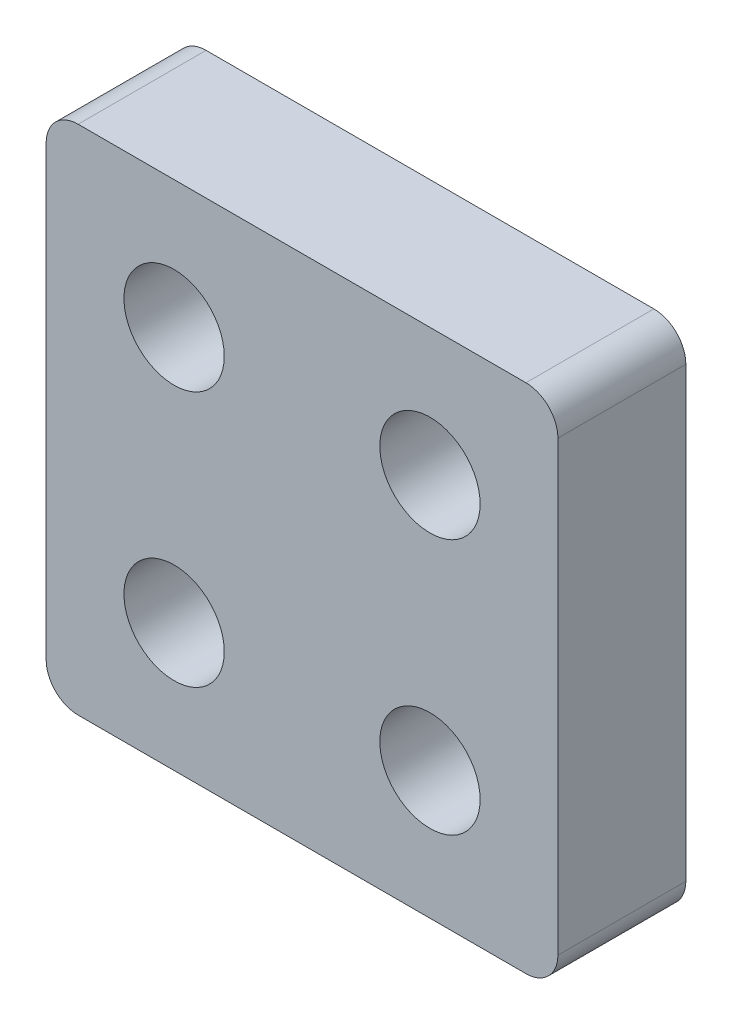
ISO-10303-21;
HEADER;
FILE_DESCRIPTION(('STEP AP214'),'2;1');
FILE_NAME('part.step','',(''),(''),'','','');
FILE_SCHEMA(('AUTOMOTIVE_DESIGN { 1 0 10303 214 1 1 1 1 }'));
ENDSEC;
DATA;
#1=APPLICATION_CONTEXT('core data for automotive mechanical design processes');
#2=APPLICATION_PROTOCOL_DEFINITION('international standard','automotive_design',2000,#1);
#3=PRODUCT_CONTEXT('',#1,'mechanical');
#4=PRODUCT('Part','Part','',(#3));
#5=PRODUCT_RELATED_PRODUCT_CATEGORY('part','',(#4));
#6=PRODUCT_DEFINITION_FORMATION('','',#4);
#7=PRODUCT_DEFINITION_CONTEXT('part definition',#1,'design');
#8=PRODUCT_DEFINITION('design','',#6,#7);
#9=PRODUCT_DEFINITION_SHAPE('','',#8);
#10=(LENGTH_UNIT() NAMED_UNIT(*) SI_UNIT(.MILLI.,.METRE.));
#11=(NAMED_UNIT(*) PLANE_ANGLE_UNIT() SI_UNIT($,.RADIAN.));
#12=(NAMED_UNIT(*) SI_UNIT($,.STERADIAN.) SOLID_ANGLE_UNIT());
#13=UNCERTAINTY_MEASURE_WITH_UNIT(LENGTH_MEASURE(1.E-05),#10,'distance_accuracy_value','');
#14=(GEOMETRIC_REPRESENTATION_CONTEXT(3) GLOBAL_UNCERTAINTY_ASSIGNED_CONTEXT((#13)) GLOBAL_UNIT_ASSIGNED_CONTEXT((#10,
#11,#12)) REPRESENTATION_CONTEXT('',''));
#15=CARTESIAN_POINT('',(0.,0.,0.));
#16=DIRECTION('',(0.,0.,1.));
#17=DIRECTION('',(1.,0.,0.));
#18=AXIS2_PLACEMENT_3D('',#15,#16,#17);
#19=CARTESIAN_POINT('',(0.,0.,6.35));
#20=DIRECTION('',(0.,0.,1.));
#21=DIRECTION('',(1.,0.,0.));
#22=AXIS2_PLACEMENT_3D('',#19,#20,#21);
#23=PLANE('',#22);
#24=CARTESIAN_POINT('',(31.7500000000001,949.212720587149,6.35));
#25=DIRECTION('',(0.,0.,1.));
#26=DIRECTION('',(1.,0.,0.));
#27=AXIS2_PLACEMENT_3D('',#24,#25,#26);
#28=CIRCLE('',#27,2.48919999999991);
#29=CARTESIAN_POINT('',(34.2392,949.212720587149,6.35));
#30=VERTEX_POINT('',#29);
#31=EDGE_CURVE('E185',#30,#30,#28,.T.);
#32=ORIENTED_EDGE('',*,*,#31,.F.);
#33=EDGE_LOOP('',(#32));
#34=FACE_BOUND('',#33,.T.);
#35=CARTESIAN_POINT('',(31.7500000000001,936.512720587149,6.35));
#36=DIRECTION('',(0.,0.,1.));
#37=DIRECTION('',(1.,0.,0.));
#38=AXIS2_PLACEMENT_3D('',#35,#36,#37);
#39=CIRCLE('',#38,2.48919999999991);
#40=CARTESIAN_POINT('',(34.2392,936.512720587149,6.35));
#41=VERTEX_POINT('',#40);
#42=EDGE_CURVE('E168',#41,#41,#39,.T.);
#43=ORIENTED_EDGE('',*,*,#42,.F.);
#44=EDGE_LOOP('',(#43));
#45=FACE_BOUND('',#44,.T.);
#46=DIRECTION('',(0.,1.,0.));
#47=VECTOR('',#46,1.);
#48=CARTESIAN_POINT('',(38.1000000000001,955.562720587149,6.35));
#49=LINE('',#48,#47);
#50=CARTESIAN_POINT('',(38.1000000000002,931.750220587149,6.35));
#51=VERTEX_POINT('',#50);
#52=CARTESIAN_POINT('',(38.1000000000001,953.975220587149,6.35));
#53=VERTEX_POINT('',#52);
#54=EDGE_CURVE('E175',#51,#53,#49,.T.);
#55=ORIENTED_EDGE('',*,*,#54,.T.);
#56=CARTESIAN_POINT('',(36.5125000000001,953.975220587149,6.35));
#57=DIRECTION('',(0.,0.,1.));
#58=DIRECTION('',(1.,0.,0.));
#59=AXIS2_PLACEMENT_3D('',#56,#57,#58);
#60=CIRCLE('',#59,1.5875);
#61=CARTESIAN_POINT('',(36.5125000000001,955.562720587149,6.35));
#62=VERTEX_POINT('',#61);
#63=EDGE_CURVE('E152',#53,#62,#60,.T.);
#64=ORIENTED_EDGE('',*,*,#63,.T.);
#65=DIRECTION('',(-1.,0.,0.));
#66=VECTOR('',#65,1.);
#67=CARTESIAN_POINT('',(12.7,955.562720587149,6.35));
#68=LINE('',#67,#66);
#69=CARTESIAN_POINT('',(14.2875,955.562720587149,6.35));
#70=VERTEX_POINT('',#69);
#71=EDGE_CURVE('E123',#62,#70,#68,.T.);
#72=ORIENTED_EDGE('',*,*,#71,.T.);
#73=CARTESIAN_POINT('',(14.2875,953.975220587149,6.35));
#74=DIRECTION('',(0.,0.,1.));
#75=DIRECTION('',(1.,0.,0.));
#76=AXIS2_PLACEMENT_3D('',#73,#74,#75);
#77=CIRCLE('',#76,1.5875);
#78=CARTESIAN_POINT('',(12.7,953.975220587149,6.35));
#79=VERTEX_POINT('',#78);
#80=EDGE_CURVE('E147',#70,#79,#77,.T.);
#81=ORIENTED_EDGE('',*,*,#80,.T.);
#82=DIRECTION('',(0.,-1.,0.));
#83=VECTOR('',#82,1.);
#84=CARTESIAN_POINT('',(12.7,955.562720587149,6.35));
#85=LINE('',#84,#83);
#86=CARTESIAN_POINT('',(12.7,931.750220587149,6.35));
#87=VERTEX_POINT('',#86);
#88=EDGE_CURVE('E130',#79,#87,#85,.T.);
#89=ORIENTED_EDGE('',*,*,#88,.T.);
#90=CARTESIAN_POINT('',(14.2875,931.750220587149,6.35));
#91=DIRECTION('',(0.,0.,1.));
#92=DIRECTION('',(1.,0.,0.));
#93=AXIS2_PLACEMENT_3D('',#90,#91,#92);
#94=CIRCLE('',#93,1.5875);
#95=CARTESIAN_POINT('',(14.2875,930.162720587149,6.35));
#96=VERTEX_POINT('',#95);
#97=EDGE_CURVE('E59',#87,#96,#94,.T.);
#98=ORIENTED_EDGE('',*,*,#97,.T.);
#99=DIRECTION('',(1.,0.,0.));
#100=VECTOR('',#99,1.);
#101=CARTESIAN_POINT('',(12.7,930.162720587149,6.35));
#102=LINE('',#101,#100);
#103=CARTESIAN_POINT('',(36.5125000000002,930.162720587149,6.35));
#104=VERTEX_POINT('',#103);
#105=EDGE_CURVE('E133',#96,#104,#102,.T.);
#106=ORIENTED_EDGE('',*,*,#105,.T.);
#107=CARTESIAN_POINT('',(36.5125000000002,931.750220587149,6.35));
#108=DIRECTION('',(0.,0.,1.));
#109=DIRECTION('',(1.,0.,0.));
#110=AXIS2_PLACEMENT_3D('',#107,#108,#109);
#111=CIRCLE('',#110,1.5875);
#112=EDGE_CURVE('E150',#104,#51,#111,.T.);
#113=ORIENTED_EDGE('',*,*,#112,.T.);
#114=EDGE_LOOP('',(#55,#64,#72,#81,#89,#98,#106,#113));
#115=FACE_BOUND('',#114,.T.);
#116=CARTESIAN_POINT('',(19.0500000000001,936.512720587149,6.35));
#117=DIRECTION('',(0.,0.,1.));
#118=DIRECTION('',(1.,0.,0.));
#119=AXIS2_PLACEMENT_3D('',#116,#117,#118);
#120=CIRCLE('',#119,2.48919999999989);
#121=CARTESIAN_POINT('',(21.5392,936.512720587149,6.35));
#122=VERTEX_POINT('',#121);
#123=EDGE_CURVE('E180',#122,#122,#120,.T.);
#124=ORIENTED_EDGE('',*,*,#123,.F.);
#125=EDGE_LOOP('',(#124));
#126=FACE_BOUND('',#125,.T.);
#127=CARTESIAN_POINT('',(19.0500000000001,949.212720587149,6.35));
#128=DIRECTION('',(0.,0.,1.));
#129=DIRECTION('',(1.,0.,0.));
#130=AXIS2_PLACEMENT_3D('',#127,#128,#129);
#131=CIRCLE('',#130,2.48919999999989);
#132=CARTESIAN_POINT('',(21.5392,949.212720587149,6.35));
#133=VERTEX_POINT('',#132);
#134=EDGE_CURVE('E191',#133,#133,#131,.T.);
#135=ORIENTED_EDGE('',*,*,#134,.F.);
#136=EDGE_LOOP('',(#135));
#137=FACE_BOUND('',#136,.T.);
#138=ADVANCED_FACE('F37',(#34,#45,#115,#126,#137),#23,.T.);
#139=CARTESIAN_POINT('',(0.,0.,0.));
#140=DIRECTION('',(0.,0.,1.));
#141=DIRECTION('',(1.,0.,0.));
#142=AXIS2_PLACEMENT_3D('',#139,#140,#141);
#143=PLANE('',#142);
#144=DIRECTION('',(-1.,0.,0.));
#145=VECTOR('',#144,1.);
#146=CARTESIAN_POINT('',(12.7,955.562720587149,0.));
#147=LINE('',#146,#145);
#148=CARTESIAN_POINT('',(36.5125000000001,955.562720587149,0.));
#149=VERTEX_POINT('',#148);
#150=CARTESIAN_POINT('',(14.2875,955.562720587149,0.));
#151=VERTEX_POINT('',#150);
#152=EDGE_CURVE('E120',#149,#151,#147,.T.);
#153=ORIENTED_EDGE('',*,*,#152,.F.);
#154=CARTESIAN_POINT('',(36.5125000000001,953.975220587149,0.));
#155=DIRECTION('',(0.,0.,1.));
#156=DIRECTION('',(1.,0.,0.));
#157=AXIS2_PLACEMENT_3D('',#154,#155,#156);
#158=CIRCLE('',#157,1.5875);
#159=CARTESIAN_POINT('',(38.1000000000001,953.975220587149,0.));
#160=VERTEX_POINT('',#159);
#161=EDGE_CURVE('E103',#149,#160,#158,.F.);
#162=ORIENTED_EDGE('',*,*,#161,.T.);
#163=DIRECTION('',(0.,1.,0.));
#164=VECTOR('',#163,1.);
#165=CARTESIAN_POINT('',(38.1000000000001,955.562720587149,0.));
#166=LINE('',#165,#164);
#167=CARTESIAN_POINT('',(38.1000000000002,931.750220587149,0.));
#168=VERTEX_POINT('',#167);
#169=EDGE_CURVE('E131',#168,#160,#166,.T.);
#170=ORIENTED_EDGE('',*,*,#169,.F.);
#171=CARTESIAN_POINT('',(36.5125000000002,931.750220587149,0.));
#172=DIRECTION('',(0.,0.,1.));
#173=DIRECTION('',(1.,0.,0.));
#174=AXIS2_PLACEMENT_3D('',#171,#172,#173);
#175=CIRCLE('',#174,1.5875);
#176=CARTESIAN_POINT('',(36.5125000000002,930.162720587149,0.));
#177=VERTEX_POINT('',#176);
#178=EDGE_CURVE('E114',#168,#177,#175,.F.);
#179=ORIENTED_EDGE('',*,*,#178,.T.);
#180=DIRECTION('',(1.,0.,0.));
#181=VECTOR('',#180,1.);
#182=CARTESIAN_POINT('',(12.7,930.162720587149,0.));
#183=LINE('',#182,#181);
#184=CARTESIAN_POINT('',(14.2875,930.162720587149,0.));
#185=VERTEX_POINT('',#184);
#186=EDGE_CURVE('E135',#185,#177,#183,.T.);
#187=ORIENTED_EDGE('',*,*,#186,.F.);
#188=CARTESIAN_POINT('',(14.2875,931.750220587149,0.));
#189=DIRECTION('',(0.,0.,1.));
#190=DIRECTION('',(1.,0.,0.));
#191=AXIS2_PLACEMENT_3D('',#188,#189,#190);
#192=CIRCLE('',#191,1.5875);
#193=CARTESIAN_POINT('',(12.7,931.750220587149,0.));
#194=VERTEX_POINT('',#193);
#195=EDGE_CURVE('E141',#185,#194,#192,.F.);
#196=ORIENTED_EDGE('',*,*,#195,.T.);
#197=DIRECTION('',(0.,-1.,0.));
#198=VECTOR('',#197,1.);
#199=CARTESIAN_POINT('',(12.7,955.562720587149,0.));
#200=LINE('',#199,#198);
#201=CARTESIAN_POINT('',(12.7,953.975220587149,0.));
#202=VERTEX_POINT('',#201);
#203=EDGE_CURVE('E163',#202,#194,#200,.T.);
#204=ORIENTED_EDGE('',*,*,#203,.F.);
#205=CARTESIAN_POINT('',(14.2875,953.975220587149,0.));
#206=DIRECTION('',(0.,0.,1.));
#207=DIRECTION('',(1.,0.,0.));
#208=AXIS2_PLACEMENT_3D('',#205,#206,#207);
#209=CIRCLE('',#208,1.5875);
#210=EDGE_CURVE('E124',#202,#151,#209,.F.);
#211=ORIENTED_EDGE('',*,*,#210,.T.);
#212=EDGE_LOOP('',(#153,#162,#170,#179,#187,#196,#204,#211));
#213=FACE_BOUND('',#212,.T.);
#214=CARTESIAN_POINT('',(31.7500000000001,936.512720587149,0.));
#215=DIRECTION('',(0.,0.,1.));
#216=DIRECTION('',(1.,0.,0.));
#217=AXIS2_PLACEMENT_3D('',#214,#215,#216);
#218=CIRCLE('',#217,2.48919999999991);
#219=CARTESIAN_POINT('',(34.2392,936.512720587149,0.));
#220=VERTEX_POINT('',#219);
#221=EDGE_CURVE('E171',#220,#220,#218,.T.);
#222=ORIENTED_EDGE('',*,*,#221,.T.);
#223=EDGE_LOOP('',(#222));
#224=FACE_BOUND('',#223,.T.);
#225=CARTESIAN_POINT('',(19.0500000000001,936.512720587149,0.));
#226=DIRECTION('',(0.,0.,1.));
#227=DIRECTION('',(1.,0.,0.));
#228=AXIS2_PLACEMENT_3D('',#225,#226,#227);
#229=CIRCLE('',#228,2.48919999999989);
#230=CARTESIAN_POINT('',(21.5392,936.512720587149,0.));
#231=VERTEX_POINT('',#230);
#232=EDGE_CURVE('E182',#231,#231,#229,.T.);
#233=ORIENTED_EDGE('',*,*,#232,.T.);
#234=EDGE_LOOP('',(#233));
#235=FACE_BOUND('',#234,.T.);
#236=CARTESIAN_POINT('',(31.7500000000001,949.212720587149,0.));
#237=DIRECTION('',(0.,0.,1.));
#238=DIRECTION('',(1.,0.,0.));
#239=AXIS2_PLACEMENT_3D('',#236,#237,#238);
#240=CIRCLE('',#239,2.48919999999991);
#241=CARTESIAN_POINT('',(34.2392,949.212720587149,0.));
#242=VERTEX_POINT('',#241);
#243=EDGE_CURVE('E188',#242,#242,#240,.T.);
#244=ORIENTED_EDGE('',*,*,#243,.T.);
#245=EDGE_LOOP('',(#244));
#246=FACE_BOUND('',#245,.T.);
#247=CARTESIAN_POINT('',(19.0500000000001,949.212720587149,0.));
#248=DIRECTION('',(0.,0.,1.));
#249=DIRECTION('',(1.,0.,0.));
#250=AXIS2_PLACEMENT_3D('',#247,#248,#249);
#251=CIRCLE('',#250,2.48919999999989);
#252=CARTESIAN_POINT('',(21.5392,949.212720587149,0.));
#253=VERTEX_POINT('',#252);
#254=EDGE_CURVE('E194',#253,#253,#251,.T.);
#255=ORIENTED_EDGE('',*,*,#254,.T.);
#256=EDGE_LOOP('',(#255));
#257=FACE_BOUND('',#256,.T.);
#258=ADVANCED_FACE('F127',(#213,#224,#235,#246,#257),#143,.F.);
#259=CARTESIAN_POINT('',(12.7,955.562720587149,6.35));
#260=DIRECTION('',(1.,0.,0.));
#261=DIRECTION('',(0.,1.,0.));
#262=AXIS2_PLACEMENT_3D('',#259,#260,#261);
#263=PLANE('',#262);
#264=ORIENTED_EDGE('',*,*,#203,.T.);
#265=DIRECTION('',(0.,0.,-1.));
#266=VECTOR('',#265,1.);
#267=CARTESIAN_POINT('',(12.7,931.750220587149,6.35));
#268=LINE('',#267,#266);
#269=EDGE_CURVE('E11',#194,#87,#268,.F.);
#270=ORIENTED_EDGE('',*,*,#269,.T.);
#271=ORIENTED_EDGE('',*,*,#88,.F.);
#272=DIRECTION('',(0.,0.,-1.));
#273=VECTOR('',#272,1.);
#274=CARTESIAN_POINT('',(12.7,953.975220587149,6.35));
#275=LINE('',#274,#273);
#276=EDGE_CURVE('E45',#79,#202,#275,.T.);
#277=ORIENTED_EDGE('',*,*,#276,.T.);
#278=EDGE_LOOP('',(#264,#270,#271,#277));
#279=FACE_BOUND('',#278,.T.);
#280=ADVANCED_FACE('F162',(#279),#263,.F.);
#281=CARTESIAN_POINT('',(12.7,930.162720587149,6.35));
#282=DIRECTION('',(0.,1.,0.));
#283=DIRECTION('',(0.,0.,1.));
#284=AXIS2_PLACEMENT_3D('',#281,#282,#283);
#285=PLANE('',#284);
#286=ORIENTED_EDGE('',*,*,#186,.T.);
#287=DIRECTION('',(0.,0.,-1.));
#288=VECTOR('',#287,1.);
#289=CARTESIAN_POINT('',(36.5125000000002,930.162720587149,6.35));
#290=LINE('',#289,#288);
#291=EDGE_CURVE('E52',#177,#104,#290,.F.);
#292=ORIENTED_EDGE('',*,*,#291,.T.);
#293=ORIENTED_EDGE('',*,*,#105,.F.);
#294=DIRECTION('',(0.,0.,-1.));
#295=VECTOR('',#294,1.);
#296=CARTESIAN_POINT('',(14.2875,930.162720587149,6.35));
#297=LINE('',#296,#295);
#298=EDGE_CURVE('E154',#96,#185,#297,.T.);
#299=ORIENTED_EDGE('',*,*,#298,.T.);
#300=EDGE_LOOP('',(#286,#292,#293,#299));
#301=FACE_BOUND('',#300,.T.);
#302=ADVANCED_FACE('F221',(#301),#285,.F.);
#303=CARTESIAN_POINT('',(38.1000000000001,955.562720587149,6.35));
#304=DIRECTION('',(-1.,0.,0.));
#305=DIRECTION('',(0.,-1.,0.));
#306=AXIS2_PLACEMENT_3D('',#303,#304,#305);
#307=PLANE('',#306);
#308=ORIENTED_EDGE('',*,*,#169,.T.);
#309=DIRECTION('',(0.,0.,-1.));
#310=VECTOR('',#309,1.);
#311=CARTESIAN_POINT('',(38.1000000000001,953.975220587149,6.35));
#312=LINE('',#311,#310);
#313=EDGE_CURVE('E108',#160,#53,#312,.F.);
#314=ORIENTED_EDGE('',*,*,#313,.T.);
#315=ORIENTED_EDGE('',*,*,#54,.F.);
#316=DIRECTION('',(0.,0.,-1.));
#317=VECTOR('',#316,1.);
#318=CARTESIAN_POINT('',(38.1000000000002,931.750220587149,6.35));
#319=LINE('',#318,#317);
#320=EDGE_CURVE('E113',#51,#168,#319,.T.);
#321=ORIENTED_EDGE('',*,*,#320,.T.);
#322=EDGE_LOOP('',(#308,#314,#315,#321));
#323=FACE_BOUND('',#322,.T.);
#324=ADVANCED_FACE('F218',(#323),#307,.F.);
#325=CARTESIAN_POINT('',(12.7,955.562720587149,6.35));
#326=DIRECTION('',(0.,-1.,0.));
#327=DIRECTION('',(0.,0.,-1.));
#328=AXIS2_PLACEMENT_3D('',#325,#326,#327);
#329=PLANE('',#328);
#330=ORIENTED_EDGE('',*,*,#71,.F.);
#331=DIRECTION('',(0.,0.,-1.));
#332=VECTOR('',#331,1.);
#333=CARTESIAN_POINT('',(36.5125000000001,955.562720587149,6.35));
#334=LINE('',#333,#332);
#335=EDGE_CURVE('E107',#62,#149,#334,.T.);
#336=ORIENTED_EDGE('',*,*,#335,.T.);
#337=ORIENTED_EDGE('',*,*,#152,.T.);
#338=DIRECTION('',(0.,0.,-1.));
#339=VECTOR('',#338,1.);
#340=CARTESIAN_POINT('',(14.2875,955.562720587149,6.35));
#341=LINE('',#340,#339);
#342=EDGE_CURVE('E125',#151,#70,#341,.F.);
#343=ORIENTED_EDGE('',*,*,#342,.T.);
#344=EDGE_LOOP('',(#330,#336,#337,#343));
#345=FACE_BOUND('',#344,.T.);
#346=ADVANCED_FACE('F119',(#345),#329,.F.);
#347=CARTESIAN_POINT('',(31.7500000000001,936.512720587149,6.35));
#348=DIRECTION('',(0.,0.,-1.));
#349=DIRECTION('',(-1.,0.,0.));
#350=AXIS2_PLACEMENT_3D('',#347,#348,#349);
#351=CYLINDRICAL_SURFACE('',#350,2.48919999999991);
#352=ORIENTED_EDGE('',*,*,#42,.T.);
#353=EDGE_LOOP('',(#352));
#354=FACE_BOUND('',#353,.T.);
#355=ORIENTED_EDGE('',*,*,#221,.F.);
#356=EDGE_LOOP('',(#355));
#357=FACE_BOUND('',#356,.T.);
#358=ADVANCED_FACE('F213',(#354,#357),#351,.F.);
#359=CARTESIAN_POINT('',(19.0500000000001,936.512720587149,6.35));
#360=DIRECTION('',(0.,0.,-1.));
#361=DIRECTION('',(-1.,0.,0.));
#362=AXIS2_PLACEMENT_3D('',#359,#360,#361);
#363=CYLINDRICAL_SURFACE('',#362,2.48919999999989);
#364=ORIENTED_EDGE('',*,*,#123,.T.);
#365=EDGE_LOOP('',(#364));
#366=FACE_BOUND('',#365,.T.);
#367=ORIENTED_EDGE('',*,*,#232,.F.);
#368=EDGE_LOOP('',(#367));
#369=FACE_BOUND('',#368,.T.);
#370=ADVANCED_FACE('F245',(#366,#369),#363,.F.);
#371=CARTESIAN_POINT('',(31.7500000000001,949.212720587149,6.35));
#372=DIRECTION('',(0.,0.,-1.));
#373=DIRECTION('',(-1.,0.,0.));
#374=AXIS2_PLACEMENT_3D('',#371,#372,#373);
#375=CYLINDRICAL_SURFACE('',#374,2.48919999999991);
#376=ORIENTED_EDGE('',*,*,#31,.T.);
#377=EDGE_LOOP('',(#376));
#378=FACE_BOUND('',#377,.T.);
#379=ORIENTED_EDGE('',*,*,#243,.F.);
#380=EDGE_LOOP('',(#379));
#381=FACE_BOUND('',#380,.T.);
#382=ADVANCED_FACE('F248',(#378,#381),#375,.F.);
#383=CARTESIAN_POINT('',(19.0500000000001,949.212720587149,6.35));
#384=DIRECTION('',(0.,0.,-1.));
#385=DIRECTION('',(-1.,0.,0.));
#386=AXIS2_PLACEMENT_3D('',#383,#384,#385);
#387=CYLINDRICAL_SURFACE('',#386,2.48919999999989);
#388=ORIENTED_EDGE('',*,*,#134,.T.);
#389=EDGE_LOOP('',(#388));
#390=FACE_BOUND('',#389,.T.);
#391=ORIENTED_EDGE('',*,*,#254,.F.);
#392=EDGE_LOOP('',(#391));
#393=FACE_BOUND('',#392,.T.);
#394=ADVANCED_FACE('F200',(#390,#393),#387,.F.);
#395=CARTESIAN_POINT('',(36.5125000000001,953.975220587149,6.35));
#396=DIRECTION('',(0.,0.,-1.));
#397=DIRECTION('',(-1.,0.,0.));
#398=AXIS2_PLACEMENT_3D('',#395,#396,#397);
#399=CYLINDRICAL_SURFACE('',#398,1.5875);
#400=ORIENTED_EDGE('',*,*,#63,.F.);
#401=ORIENTED_EDGE('',*,*,#313,.F.);
#402=ORIENTED_EDGE('',*,*,#161,.F.);
#403=ORIENTED_EDGE('',*,*,#335,.F.);
#404=EDGE_LOOP('',(#400,#401,#402,#403));
#405=FACE_BOUND('',#404,.T.);
#406=ADVANCED_FACE('F106',(#405),#399,.T.);
#407=CARTESIAN_POINT('',(36.5125000000002,931.750220587149,6.35));
#408=DIRECTION('',(0.,0.,-1.));
#409=DIRECTION('',(-1.,0.,0.));
#410=AXIS2_PLACEMENT_3D('',#407,#408,#409);
#411=CYLINDRICAL_SURFACE('',#410,1.5875);
#412=ORIENTED_EDGE('',*,*,#112,.F.);
#413=ORIENTED_EDGE('',*,*,#291,.F.);
#414=ORIENTED_EDGE('',*,*,#178,.F.);
#415=ORIENTED_EDGE('',*,*,#320,.F.);
#416=EDGE_LOOP('',(#412,#413,#414,#415));
#417=FACE_BOUND('',#416,.T.);
#418=ADVANCED_FACE('F229',(#417),#411,.T.);
#419=CARTESIAN_POINT('',(14.2875,931.750220587149,6.35));
#420=DIRECTION('',(0.,0.,-1.));
#421=DIRECTION('',(-1.,0.,0.));
#422=AXIS2_PLACEMENT_3D('',#419,#420,#421);
#423=CYLINDRICAL_SURFACE('',#422,1.5875);
#424=ORIENTED_EDGE('',*,*,#97,.F.);
#425=ORIENTED_EDGE('',*,*,#269,.F.);
#426=ORIENTED_EDGE('',*,*,#195,.F.);
#427=ORIENTED_EDGE('',*,*,#298,.F.);
#428=EDGE_LOOP('',(#424,#425,#426,#427));
#429=FACE_BOUND('',#428,.T.);
#430=ADVANCED_FACE('F231',(#429),#423,.T.);
#431=CARTESIAN_POINT('',(14.2875,953.975220587149,6.35));
#432=DIRECTION('',(0.,0.,-1.));
#433=DIRECTION('',(-1.,0.,0.));
#434=AXIS2_PLACEMENT_3D('',#431,#432,#433);
#435=CYLINDRICAL_SURFACE('',#434,1.5875);
#436=ORIENTED_EDGE('',*,*,#80,.F.);
#437=ORIENTED_EDGE('',*,*,#342,.F.);
#438=ORIENTED_EDGE('',*,*,#210,.F.);
#439=ORIENTED_EDGE('',*,*,#276,.F.);
#440=EDGE_LOOP('',(#436,#437,#438,#439));
#441=FACE_BOUND('',#440,.T.);
#442=ADVANCED_FACE('F39',(#441),#435,.T.);
#443=CLOSED_SHELL('',(#138,#258,#280,#302,#324,#346,#358,#370,#382,#394,#406,#418,#430,#442));
#444=MANIFOLD_SOLID_BREP('B2',#443);
#445=ADVANCED_BREP_SHAPE_REPRESENTATION('',(#18,#444),#14);
#446=SHAPE_DEFINITION_REPRESENTATION(#9,#445);
ENDSEC;
END-ISO-10303-21;
